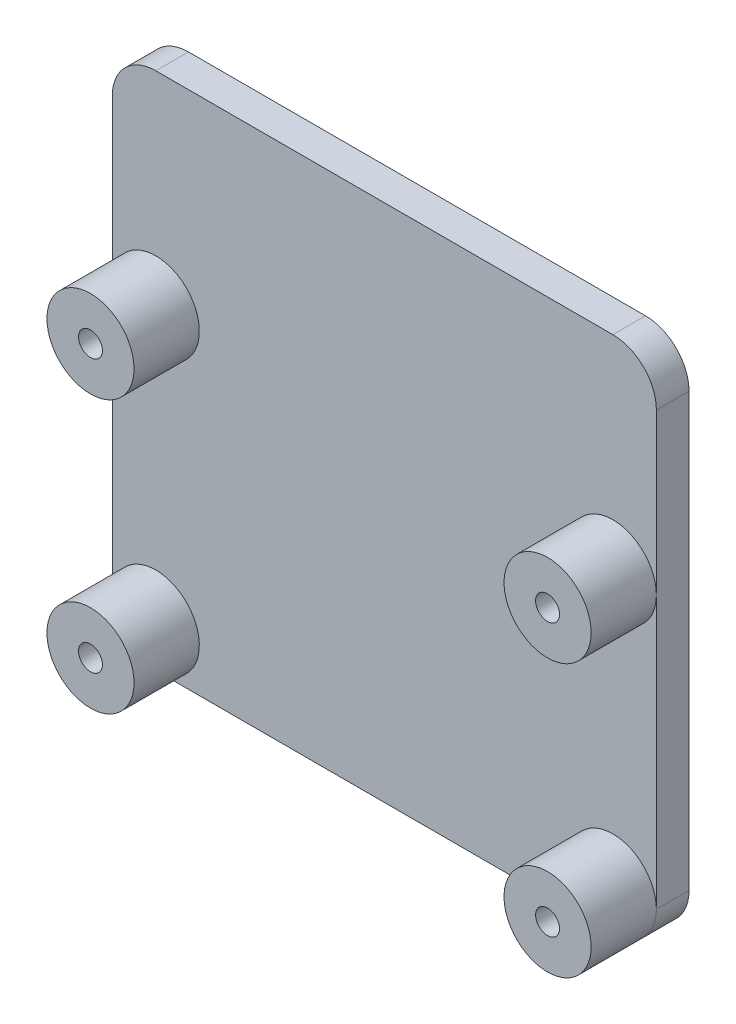
ISO-10303-21;
HEADER;
FILE_DESCRIPTION(('STEP AP214'),'2;1');
FILE_NAME('part.step','',(''),(''),'','','');
FILE_SCHEMA(('AUTOMOTIVE_DESIGN { 1 0 10303 214 1 1 1 1 }'));
ENDSEC;
DATA;
#1=APPLICATION_CONTEXT('core data for automotive mechanical design processes');
#2=APPLICATION_PROTOCOL_DEFINITION('international standard','automotive_design',2000,#1);
#3=PRODUCT_CONTEXT('',#1,'mechanical');
#4=PRODUCT('Part','Part','',(#3));
#5=PRODUCT_RELATED_PRODUCT_CATEGORY('part','',(#4));
#6=PRODUCT_DEFINITION_FORMATION('','',#4);
#7=PRODUCT_DEFINITION_CONTEXT('part definition',#1,'design');
#8=PRODUCT_DEFINITION('design','',#6,#7);
#9=PRODUCT_DEFINITION_SHAPE('','',#8);
#10=(LENGTH_UNIT() NAMED_UNIT(*) SI_UNIT(.MILLI.,.METRE.));
#11=(NAMED_UNIT(*) PLANE_ANGLE_UNIT() SI_UNIT($,.RADIAN.));
#12=(NAMED_UNIT(*) SI_UNIT($,.STERADIAN.) SOLID_ANGLE_UNIT());
#13=UNCERTAINTY_MEASURE_WITH_UNIT(LENGTH_MEASURE(1.E-05),#10,'distance_accuracy_value','');
#14=(GEOMETRIC_REPRESENTATION_CONTEXT(3) GLOBAL_UNCERTAINTY_ASSIGNED_CONTEXT((#13)) GLOBAL_UNIT_ASSIGNED_CONTEXT((#10,
#11,#12)) REPRESENTATION_CONTEXT('',''));
#15=CARTESIAN_POINT('',(0.,0.,0.));
#16=DIRECTION('',(0.,0.,1.));
#17=DIRECTION('',(1.,0.,0.));
#18=AXIS2_PLACEMENT_3D('',#15,#16,#17);
#19=CARTESIAN_POINT('',(-7.28237405594401,-77.1896894364136,1.5));
#20=DIRECTION('',(0.,1.,0.));
#21=DIRECTION('',(0.,0.,1.));
#22=AXIS2_PLACEMENT_3D('',#19,#20,#21);
#23=PLANE('',#22);
#24=DIRECTION('',(1.,0.,0.));
#25=VECTOR('',#24,1.);
#26=CARTESIAN_POINT('',(-7.28237405594401,-77.1896894364136,0.));
#27=LINE('',#26,#25);
#28=CARTESIAN_POINT('',(-5.28237405594401,-77.1896894364136,0.));
#29=VERTEX_POINT('',#28);
#30=CARTESIAN_POINT('',(15.717625944056,-77.1896894364136,0.));
#31=VERTEX_POINT('',#30);
#32=EDGE_CURVE('E163',#29,#31,#27,.T.);
#33=ORIENTED_EDGE('',*,*,#32,.T.);
#34=DIRECTION('',(0.,0.,-1.));
#35=VECTOR('',#34,1.);
#36=CARTESIAN_POINT('',(15.717625944056,-77.1896894364136,1.5));
#37=LINE('',#36,#35);
#38=CARTESIAN_POINT('',(15.717625944056,-77.1896894364136,1.5));
#39=VERTEX_POINT('',#38);
#40=EDGE_CURVE('E202',#31,#39,#37,.F.);
#41=ORIENTED_EDGE('',*,*,#40,.T.);
#42=DIRECTION('',(1.,0.,0.));
#43=VECTOR('',#42,1.);
#44=CARTESIAN_POINT('',(-7.28237405594401,-77.1896894364136,1.5));
#45=LINE('',#44,#43);
#46=CARTESIAN_POINT('',(-5.282374055944,-77.1896894364136,1.5));
#47=VERTEX_POINT('',#46);
#48=EDGE_CURVE('E166',#47,#39,#45,.T.);
#49=ORIENTED_EDGE('',*,*,#48,.F.);
#50=DIRECTION('',(0.,0.,-1.));
#51=VECTOR('',#50,1.);
#52=CARTESIAN_POINT('',(-5.282374055944,-77.1896894364136,1.5));
#53=LINE('',#52,#51);
#54=EDGE_CURVE('E139',#47,#29,#53,.T.);
#55=ORIENTED_EDGE('',*,*,#54,.T.);
#56=EDGE_LOOP('',(#33,#41,#49,#55));
#57=FACE_BOUND('',#56,.T.);
#58=ADVANCED_FACE('F36',(#57),#23,.F.);
#59=CARTESIAN_POINT('',(17.717625944056,-77.1896894364136,1.5));
#60=DIRECTION('',(-1.,0.,0.));
#61=DIRECTION('',(0.,-1.,0.));
#62=AXIS2_PLACEMENT_3D('',#59,#60,#61);
#63=PLANE('',#62);
#64=DIRECTION('',(0.,1.,0.));
#65=VECTOR('',#64,1.);
#66=CARTESIAN_POINT('',(17.717625944056,-77.1896894364136,0.));
#67=LINE('',#66,#65);
#68=CARTESIAN_POINT('',(17.717625944056,-75.1896894364136,0.));
#69=VERTEX_POINT('',#68);
#70=CARTESIAN_POINT('',(17.717625944056,-55.3276894364136,0.));
#71=VERTEX_POINT('',#70);
#72=EDGE_CURVE('E174',#69,#71,#67,.T.);
#73=ORIENTED_EDGE('',*,*,#72,.T.);
#74=DIRECTION('',(0.,0.,-1.));
#75=VECTOR('',#74,1.);
#76=CARTESIAN_POINT('',(17.717625944056,-55.3276894364136,1.5));
#77=LINE('',#76,#75);
#78=CARTESIAN_POINT('',(17.717625944056,-55.3276894364136,1.5));
#79=VERTEX_POINT('',#78);
#80=EDGE_CURVE('E59',#71,#79,#77,.F.);
#81=ORIENTED_EDGE('',*,*,#80,.T.);
#82=DIRECTION('',(0.,1.,0.));
#83=VECTOR('',#82,1.);
#84=CARTESIAN_POINT('',(17.717625944056,-77.1896894364136,1.5));
#85=LINE('',#84,#83);
#86=CARTESIAN_POINT('',(17.717625944056,-62.6896894364136,1.5));
#87=VERTEX_POINT('',#86);
#88=EDGE_CURVE('E168',#87,#79,#85,.T.);
#89=ORIENTED_EDGE('',*,*,#88,.F.);
#90=CARTESIAN_POINT('',(17.717625944056,-75.1896894364136,1.5));
#91=VERTEX_POINT('',#90);
#92=EDGE_CURVE('E169',#91,#87,#85,.T.);
#93=ORIENTED_EDGE('',*,*,#92,.F.);
#94=DIRECTION('',(0.,0.,-1.));
#95=VECTOR('',#94,1.);
#96=CARTESIAN_POINT('',(17.717625944056,-75.1896894364136,1.5));
#97=LINE('',#96,#95);
#98=EDGE_CURVE('E194',#91,#69,#97,.T.);
#99=ORIENTED_EDGE('',*,*,#98,.T.);
#100=EDGE_LOOP('',(#73,#81,#89,#93,#99));
#101=FACE_BOUND('',#100,.T.);
#102=ADVANCED_FACE('F219',(#101),#63,.F.);
#103=CARTESIAN_POINT('',(17.717625944056,-53.3276894364136,1.5));
#104=DIRECTION('',(0.,-1.,0.));
#105=DIRECTION('',(1.,0.,0.));
#106=AXIS2_PLACEMENT_3D('',#103,#104,#105);
#107=PLANE('',#106);
#108=DIRECTION('',(-1.,0.,0.));
#109=VECTOR('',#108,1.);
#110=CARTESIAN_POINT('',(17.717625944056,-53.3276894364136,1.5));
#111=LINE('',#110,#109);
#112=CARTESIAN_POINT('',(15.717625944056,-53.3276894364136,1.5));
#113=VERTEX_POINT('',#112);
#114=CARTESIAN_POINT('',(-5.282374055944,-53.3276894364136,1.5));
#115=VERTEX_POINT('',#114);
#116=EDGE_CURVE('E134',#113,#115,#111,.T.);
#117=ORIENTED_EDGE('',*,*,#116,.F.);
#118=DIRECTION('',(0.,0.,-1.));
#119=VECTOR('',#118,1.);
#120=CARTESIAN_POINT('',(15.717625944056,-53.3276894364136,1.5));
#121=LINE('',#120,#119);
#122=CARTESIAN_POINT('',(15.717625944056,-53.3276894364136,0.));
#123=VERTEX_POINT('',#122);
#124=EDGE_CURVE('E183',#113,#123,#121,.T.);
#125=ORIENTED_EDGE('',*,*,#124,.T.);
#126=DIRECTION('',(-1.,0.,0.));
#127=VECTOR('',#126,1.);
#128=CARTESIAN_POINT('',(17.717625944056,-53.3276894364136,0.));
#129=LINE('',#128,#127);
#130=CARTESIAN_POINT('',(-5.282374055944,-53.3276894364136,0.));
#131=VERTEX_POINT('',#130);
#132=EDGE_CURVE('E176',#123,#131,#129,.T.);
#133=ORIENTED_EDGE('',*,*,#132,.T.);
#134=DIRECTION('',(0.,0.,-1.));
#135=VECTOR('',#134,1.);
#136=CARTESIAN_POINT('',(-5.282374055944,-53.3276894364136,1.5));
#137=LINE('',#136,#135);
#138=EDGE_CURVE('E126',#131,#115,#137,.F.);
#139=ORIENTED_EDGE('',*,*,#138,.T.);
#140=EDGE_LOOP('',(#117,#125,#133,#139));
#141=FACE_BOUND('',#140,.T.);
#142=ADVANCED_FACE('F226',(#141),#107,.F.);
#143=CARTESIAN_POINT('',(-7.282374055944,-53.3276894364136,1.5));
#144=DIRECTION('',(1.,0.,0.));
#145=DIRECTION('',(0.,1.,0.));
#146=AXIS2_PLACEMENT_3D('',#143,#144,#145);
#147=PLANE('',#146);
#148=DIRECTION('',(0.,-1.,0.));
#149=VECTOR('',#148,1.);
#150=CARTESIAN_POINT('',(-7.282374055944,-53.3276894364136,0.));
#151=LINE('',#150,#149);
#152=CARTESIAN_POINT('',(-7.282374055944,-55.3276894364136,0.));
#153=VERTEX_POINT('',#152);
#154=CARTESIAN_POINT('',(-7.282374055944,-75.1896894364136,0.));
#155=VERTEX_POINT('',#154);
#156=EDGE_CURVE('E116',#153,#155,#151,.T.);
#157=ORIENTED_EDGE('',*,*,#156,.T.);
#158=DIRECTION('',(0.,0.,-1.));
#159=VECTOR('',#158,1.);
#160=CARTESIAN_POINT('',(-7.282374055944,-75.1896894364136,1.5));
#161=LINE('',#160,#159);
#162=CARTESIAN_POINT('',(-7.28237405594401,-75.1896894364136,1.5));
#163=VERTEX_POINT('',#162);
#164=EDGE_CURVE('E11',#155,#163,#161,.F.);
#165=ORIENTED_EDGE('',*,*,#164,.T.);
#166=DIRECTION('',(0.,-1.,0.));
#167=VECTOR('',#166,1.);
#168=CARTESIAN_POINT('',(-7.282374055944,-53.3276894364136,1.5));
#169=LINE('',#168,#167);
#170=CARTESIAN_POINT('',(-7.282374055944,-62.6896894364136,1.5));
#171=VERTEX_POINT('',#170);
#172=EDGE_CURVE('E113',#171,#163,#169,.T.);
#173=ORIENTED_EDGE('',*,*,#172,.F.);
#174=CARTESIAN_POINT('',(-7.282374055944,-55.3276894364136,1.5));
#175=VERTEX_POINT('',#174);
#176=EDGE_CURVE('E133',#175,#171,#169,.T.);
#177=ORIENTED_EDGE('',*,*,#176,.F.);
#178=DIRECTION('',(0.,0.,-1.));
#179=VECTOR('',#178,1.);
#180=CARTESIAN_POINT('',(-7.282374055944,-55.3276894364136,1.5));
#181=LINE('',#180,#179);
#182=EDGE_CURVE('E44',#175,#153,#181,.T.);
#183=ORIENTED_EDGE('',*,*,#182,.T.);
#184=EDGE_LOOP('',(#157,#165,#173,#177,#183));
#185=FACE_BOUND('',#184,.T.);
#186=ADVANCED_FACE('F111',(#185),#147,.F.);
#187=CARTESIAN_POINT('',(0.,0.,1.5));
#188=DIRECTION('',(0.,0.,1.));
#189=DIRECTION('',(1.,0.,0.));
#190=AXIS2_PLACEMENT_3D('',#187,#188,#189);
#191=PLANE('',#190);
#192=ORIENTED_EDGE('',*,*,#88,.T.);
#193=CARTESIAN_POINT('',(15.717625944056,-55.3276894364136,1.5));
#194=DIRECTION('',(0.,0.,1.));
#195=DIRECTION('',(1.,0.,0.));
#196=AXIS2_PLACEMENT_3D('',#193,#194,#195);
#197=CIRCLE('',#196,2.);
#198=EDGE_CURVE('E199',#79,#113,#197,.T.);
#199=ORIENTED_EDGE('',*,*,#198,.T.);
#200=ORIENTED_EDGE('',*,*,#116,.T.);
#201=CARTESIAN_POINT('',(-5.282374055944,-55.3276894364136,1.5));
#202=DIRECTION('',(0.,0.,1.));
#203=DIRECTION('',(1.,0.,0.));
#204=AXIS2_PLACEMENT_3D('',#201,#202,#203);
#205=CIRCLE('',#204,2.);
#206=EDGE_CURVE('E51',#115,#175,#205,.T.);
#207=ORIENTED_EDGE('',*,*,#206,.T.);
#208=ORIENTED_EDGE('',*,*,#176,.T.);
#209=CARTESIAN_POINT('',(-5.28237405594401,-62.6896894364136,1.5));
#210=DIRECTION('',(0.,0.,1.));
#211=DIRECTION('',(1.,0.,0.));
#212=AXIS2_PLACEMENT_3D('',#209,#210,#211);
#213=CIRCLE('',#212,2.);
#214=EDGE_CURVE('E132',#171,#171,#213,.T.);
#215=ORIENTED_EDGE('',*,*,#214,.F.);
#216=ORIENTED_EDGE('',*,*,#172,.T.);
#217=CARTESIAN_POINT('',(-5.282374055944,-75.1896894364136,1.5));
#218=DIRECTION('',(0.,0.,1.));
#219=DIRECTION('',(1.,0.,0.));
#220=AXIS2_PLACEMENT_3D('',#217,#218,#219);
#221=CIRCLE('',#220,2.);
#222=EDGE_CURVE('E121',#163,#47,#221,.F.);
#223=ORIENTED_EDGE('',*,*,#222,.T.);
#224=ORIENTED_EDGE('',*,*,#48,.T.);
#225=CARTESIAN_POINT('',(15.717625944056,-75.1896894364136,1.5));
#226=DIRECTION('',(0.,0.,1.));
#227=DIRECTION('',(1.,0.,0.));
#228=AXIS2_PLACEMENT_3D('',#225,#226,#227);
#229=CIRCLE('',#228,2.);
#230=EDGE_CURVE('E152',#91,#39,#229,.T.);
#231=ORIENTED_EDGE('',*,*,#230,.F.);
#232=ORIENTED_EDGE('',*,*,#92,.T.);
#233=CARTESIAN_POINT('',(15.717625944056,-62.6896894364136,1.5));
#234=DIRECTION('',(0.,0.,1.));
#235=DIRECTION('',(1.,0.,0.));
#236=AXIS2_PLACEMENT_3D('',#233,#234,#235);
#237=CIRCLE('',#236,2.00000000000001);
#238=EDGE_CURVE('E157',#87,#87,#237,.T.);
#239=ORIENTED_EDGE('',*,*,#238,.F.);
#240=EDGE_LOOP('',(#192,#199,#200,#207,#208,#215,#216,#223,#224,#231,#232,#239));
#241=FACE_BOUND('',#240,.T.);
#242=ADVANCED_FACE('F130',(#241),#191,.T.);
#243=CARTESIAN_POINT('',(0.,0.,0.));
#244=DIRECTION('',(0.,0.,1.));
#245=DIRECTION('',(1.,0.,0.));
#246=AXIS2_PLACEMENT_3D('',#243,#244,#245);
#247=PLANE('',#246);
#248=CARTESIAN_POINT('',(-5.282374055944,-75.1896894364136,0.));
#249=DIRECTION('',(0.,0.,1.));
#250=DIRECTION('',(1.,0.,0.));
#251=AXIS2_PLACEMENT_3D('',#248,#249,#250);
#252=CIRCLE('',#251,0.549999999999995);
#253=CARTESIAN_POINT('',(-4.73237405594401,-75.1896894364136,0.));
#254=VERTEX_POINT('',#253);
#255=EDGE_CURVE('E386',#254,#254,#252,.F.);
#256=ORIENTED_EDGE('',*,*,#255,.F.);
#257=EDGE_LOOP('',(#256));
#258=FACE_BOUND('',#257,.T.);
#259=CARTESIAN_POINT('',(15.717625944056,-75.1896894364136,0.));
#260=DIRECTION('',(0.,0.,1.));
#261=DIRECTION('',(1.,0.,0.));
#262=AXIS2_PLACEMENT_3D('',#259,#260,#261);
#263=CIRCLE('',#262,0.549999999999998);
#264=CARTESIAN_POINT('',(16.267625944056,-75.1896894364136,0.));
#265=VERTEX_POINT('',#264);
#266=EDGE_CURVE('E378',#265,#265,#263,.F.);
#267=ORIENTED_EDGE('',*,*,#266,.F.);
#268=EDGE_LOOP('',(#267));
#269=FACE_BOUND('',#268,.T.);
#270=CARTESIAN_POINT('',(15.717625944056,-62.6896894364136,0.));
#271=DIRECTION('',(0.,0.,1.));
#272=DIRECTION('',(1.,0.,0.));
#273=AXIS2_PLACEMENT_3D('',#270,#271,#272);
#274=CIRCLE('',#273,0.550000000000001);
#275=CARTESIAN_POINT('',(16.267625944056,-62.6896894364136,0.));
#276=VERTEX_POINT('',#275);
#277=EDGE_CURVE('E374',#276,#276,#274,.F.);
#278=ORIENTED_EDGE('',*,*,#277,.F.);
#279=EDGE_LOOP('',(#278));
#280=FACE_BOUND('',#279,.T.);
#281=CARTESIAN_POINT('',(-5.28237405594401,-62.6896894364136,0.));
#282=DIRECTION('',(0.,0.,1.));
#283=DIRECTION('',(1.,0.,0.));
#284=AXIS2_PLACEMENT_3D('',#281,#282,#283);
#285=CIRCLE('',#284,0.550000000000001);
#286=CARTESIAN_POINT('',(-4.73237405594401,-62.6896894364136,0.));
#287=VERTEX_POINT('',#286);
#288=EDGE_CURVE('E141',#287,#287,#285,.F.);
#289=ORIENTED_EDGE('',*,*,#288,.F.);
#290=EDGE_LOOP('',(#289));
#291=FACE_BOUND('',#290,.T.);
#292=ORIENTED_EDGE('',*,*,#132,.F.);
#293=CARTESIAN_POINT('',(15.717625944056,-55.3276894364136,0.));
#294=DIRECTION('',(0.,0.,1.));
#295=DIRECTION('',(1.,0.,0.));
#296=AXIS2_PLACEMENT_3D('',#293,#294,#295);
#297=CIRCLE('',#296,2.);
#298=EDGE_CURVE('E192',#123,#71,#297,.F.);
#299=ORIENTED_EDGE('',*,*,#298,.T.);
#300=ORIENTED_EDGE('',*,*,#72,.F.);
#301=CARTESIAN_POINT('',(15.717625944056,-75.1896894364136,0.));
#302=DIRECTION('',(0.,0.,1.));
#303=DIRECTION('',(1.,0.,0.));
#304=AXIS2_PLACEMENT_3D('',#301,#302,#303);
#305=CIRCLE('',#304,2.);
#306=EDGE_CURVE('E190',#69,#31,#305,.F.);
#307=ORIENTED_EDGE('',*,*,#306,.T.);
#308=ORIENTED_EDGE('',*,*,#32,.F.);
#309=CARTESIAN_POINT('',(-5.282374055944,-75.1896894364136,0.));
#310=DIRECTION('',(0.,0.,1.));
#311=DIRECTION('',(1.,0.,0.));
#312=AXIS2_PLACEMENT_3D('',#309,#310,#311);
#313=CIRCLE('',#312,2.);
#314=EDGE_CURVE('E188',#29,#155,#313,.F.);
#315=ORIENTED_EDGE('',*,*,#314,.T.);
#316=ORIENTED_EDGE('',*,*,#156,.F.);
#317=CARTESIAN_POINT('',(-5.282374055944,-55.3276894364136,0.));
#318=DIRECTION('',(0.,0.,1.));
#319=DIRECTION('',(1.,0.,0.));
#320=AXIS2_PLACEMENT_3D('',#317,#318,#319);
#321=CIRCLE('',#320,2.);
#322=EDGE_CURVE('E186',#153,#131,#321,.F.);
#323=ORIENTED_EDGE('',*,*,#322,.T.);
#324=EDGE_LOOP('',(#292,#299,#300,#307,#308,#315,#316,#323));
#325=FACE_BOUND('',#324,.T.);
#326=ADVANCED_FACE('F207',(#258,#269,#280,#291,#325),#247,.F.);
#327=CARTESIAN_POINT('',(15.717625944056,-62.6896894364136,4.5));
#328=DIRECTION('',(0.,0.,-1.));
#329=DIRECTION('',(-1.,0.,0.));
#330=AXIS2_PLACEMENT_3D('',#327,#328,#329);
#331=CYLINDRICAL_SURFACE('',#330,2.00000000000001);
#332=CARTESIAN_POINT('',(15.717625944056,-62.6896894364136,4.5));
#333=DIRECTION('',(0.,0.,1.));
#334=DIRECTION('',(1.,0.,0.));
#335=AXIS2_PLACEMENT_3D('',#332,#333,#334);
#336=CIRCLE('',#335,2.00000000000001);
#337=CARTESIAN_POINT('',(17.717625944056,-62.6896894364136,4.5));
#338=VERTEX_POINT('',#337);
#339=EDGE_CURVE('E160',#338,#338,#336,.T.);
#340=ORIENTED_EDGE('',*,*,#339,.F.);
#341=EDGE_LOOP('',(#340));
#342=FACE_BOUND('',#341,.T.);
#343=ORIENTED_EDGE('',*,*,#238,.T.);
#344=EDGE_LOOP('',(#343));
#345=FACE_BOUND('',#344,.T.);
#346=ADVANCED_FACE('F271',(#342,#345),#331,.T.);
#347=CARTESIAN_POINT('',(0.,0.,4.5));
#348=DIRECTION('',(0.,0.,1.));
#349=DIRECTION('',(1.,0.,0.));
#350=AXIS2_PLACEMENT_3D('',#347,#348,#349);
#351=PLANE('',#350);
#352=CARTESIAN_POINT('',(15.717625944056,-62.6896894364136,4.5));
#353=DIRECTION('',(0.,0.,1.));
#354=DIRECTION('',(1.,0.,0.));
#355=AXIS2_PLACEMENT_3D('',#352,#353,#354);
#356=CIRCLE('',#355,0.550000000000001);
#357=CARTESIAN_POINT('',(16.267625944056,-62.6896894364136,4.5));
#358=VERTEX_POINT('',#357);
#359=EDGE_CURVE('E377',#358,#358,#356,.T.);
#360=ORIENTED_EDGE('',*,*,#359,.F.);
#361=EDGE_LOOP('',(#360));
#362=FACE_BOUND('',#361,.T.);
#363=ORIENTED_EDGE('',*,*,#339,.T.);
#364=EDGE_LOOP('',(#363));
#365=FACE_BOUND('',#364,.T.);
#366=ADVANCED_FACE('F279',(#362,#365),#351,.T.);
#367=CARTESIAN_POINT('',(15.717625944056,-75.1896894364136,4.5));
#368=DIRECTION('',(0.,0.,-1.));
#369=DIRECTION('',(-1.,0.,0.));
#370=AXIS2_PLACEMENT_3D('',#367,#368,#369);
#371=CYLINDRICAL_SURFACE('',#370,2.);
#372=CARTESIAN_POINT('',(15.717625944056,-75.1896894364136,4.5));
#373=DIRECTION('',(0.,0.,1.));
#374=DIRECTION('',(1.,0.,0.));
#375=AXIS2_PLACEMENT_3D('',#372,#373,#374);
#376=CIRCLE('',#375,2.);
#377=CARTESIAN_POINT('',(17.717625944056,-75.1896894364136,4.5));
#378=VERTEX_POINT('',#377);
#379=EDGE_CURVE('E154',#378,#378,#376,.T.);
#380=ORIENTED_EDGE('',*,*,#379,.F.);
#381=EDGE_LOOP('',(#380));
#382=FACE_BOUND('',#381,.T.);
#383=ORIENTED_EDGE('',*,*,#230,.T.);
#384=CARTESIAN_POINT('',(15.717625944056,-75.1896894364136,1.5));
#385=DIRECTION('',(0.,0.,1.));
#386=DIRECTION('',(1.,0.,0.));
#387=AXIS2_PLACEMENT_3D('',#384,#385,#386);
#388=CIRCLE('',#387,2.);
#389=EDGE_CURVE('E127',#91,#39,#388,.F.);
#390=ORIENTED_EDGE('',*,*,#389,.F.);
#391=EDGE_LOOP('',(#383,#390));
#392=FACE_BOUND('',#391,.T.);
#393=ADVANCED_FACE('F214',(#382,#392),#371,.T.);
#394=CARTESIAN_POINT('',(0.,0.,4.5));
#395=DIRECTION('',(0.,0.,1.));
#396=DIRECTION('',(1.,0.,0.));
#397=AXIS2_PLACEMENT_3D('',#394,#395,#396);
#398=PLANE('',#397);
#399=CARTESIAN_POINT('',(15.717625944056,-75.1896894364136,4.5));
#400=DIRECTION('',(0.,0.,1.));
#401=DIRECTION('',(1.,0.,0.));
#402=AXIS2_PLACEMENT_3D('',#399,#400,#401);
#403=CIRCLE('',#402,0.549999999999998);
#404=CARTESIAN_POINT('',(16.267625944056,-75.1896894364136,4.5));
#405=VERTEX_POINT('',#404);
#406=EDGE_CURVE('E382',#405,#405,#403,.T.);
#407=ORIENTED_EDGE('',*,*,#406,.F.);
#408=EDGE_LOOP('',(#407));
#409=FACE_BOUND('',#408,.T.);
#410=ORIENTED_EDGE('',*,*,#379,.T.);
#411=EDGE_LOOP('',(#410));
#412=FACE_BOUND('',#411,.T.);
#413=ADVANCED_FACE('F295',(#409,#412),#398,.T.);
#414=CARTESIAN_POINT('',(-5.28237405594401,-62.6896894364136,4.5));
#415=DIRECTION('',(0.,0.,-1.));
#416=DIRECTION('',(-1.,0.,0.));
#417=AXIS2_PLACEMENT_3D('',#414,#415,#416);
#418=CYLINDRICAL_SURFACE('',#417,2.);
#419=CARTESIAN_POINT('',(-5.28237405594401,-62.6896894364136,4.5));
#420=DIRECTION('',(0.,0.,1.));
#421=DIRECTION('',(1.,0.,0.));
#422=AXIS2_PLACEMENT_3D('',#419,#420,#421);
#423=CIRCLE('',#422,2.);
#424=CARTESIAN_POINT('',(-3.28237405594401,-62.6896894364136,4.5));
#425=VERTEX_POINT('',#424);
#426=EDGE_CURVE('E149',#425,#425,#423,.T.);
#427=ORIENTED_EDGE('',*,*,#426,.F.);
#428=EDGE_LOOP('',(#427));
#429=FACE_BOUND('',#428,.T.);
#430=ORIENTED_EDGE('',*,*,#214,.T.);
#431=EDGE_LOOP('',(#430));
#432=FACE_BOUND('',#431,.T.);
#433=ADVANCED_FACE('F304',(#429,#432),#418,.T.);
#434=CARTESIAN_POINT('',(0.,0.,4.5));
#435=DIRECTION('',(0.,0.,1.));
#436=DIRECTION('',(1.,0.,0.));
#437=AXIS2_PLACEMENT_3D('',#434,#435,#436);
#438=PLANE('',#437);
#439=CARTESIAN_POINT('',(-5.28237405594401,-62.6896894364136,4.5));
#440=DIRECTION('',(0.,0.,1.));
#441=DIRECTION('',(1.,0.,0.));
#442=AXIS2_PLACEMENT_3D('',#439,#440,#441);
#443=CIRCLE('',#442,0.550000000000001);
#444=CARTESIAN_POINT('',(-4.73237405594401,-62.6896894364136,4.5));
#445=VERTEX_POINT('',#444);
#446=EDGE_CURVE('E146',#445,#445,#443,.T.);
#447=ORIENTED_EDGE('',*,*,#446,.F.);
#448=EDGE_LOOP('',(#447));
#449=FACE_BOUND('',#448,.T.);
#450=ORIENTED_EDGE('',*,*,#426,.T.);
#451=EDGE_LOOP('',(#450));
#452=FACE_BOUND('',#451,.T.);
#453=ADVANCED_FACE('F312',(#449,#452),#438,.T.);
#454=CARTESIAN_POINT('',(-5.282374055944,-75.1896894364136,4.5));
#455=DIRECTION('',(0.,0.,-1.));
#456=DIRECTION('',(-1.,0.,0.));
#457=AXIS2_PLACEMENT_3D('',#454,#455,#456);
#458=CYLINDRICAL_SURFACE('',#457,2.);
#459=CARTESIAN_POINT('',(-5.282374055944,-75.1896894364136,4.5));
#460=DIRECTION('',(0.,0.,1.));
#461=DIRECTION('',(1.,0.,0.));
#462=AXIS2_PLACEMENT_3D('',#459,#460,#461);
#463=CIRCLE('',#462,2.);
#464=CARTESIAN_POINT('',(-3.282374055944,-75.1896894364136,4.5));
#465=VERTEX_POINT('',#464);
#466=EDGE_CURVE('E140',#465,#465,#463,.T.);
#467=ORIENTED_EDGE('',*,*,#466,.F.);
#468=EDGE_LOOP('',(#467));
#469=FACE_BOUND('',#468,.T.);
#470=CARTESIAN_POINT('',(-5.282374055944,-75.1896894364136,1.5));
#471=DIRECTION('',(0.,0.,1.));
#472=DIRECTION('',(1.,0.,0.));
#473=AXIS2_PLACEMENT_3D('',#470,#471,#472);
#474=CIRCLE('',#473,2.);
#475=EDGE_CURVE('E123',#163,#47,#474,.T.);
#476=ORIENTED_EDGE('',*,*,#475,.T.);
#477=ORIENTED_EDGE('',*,*,#222,.F.);
#478=EDGE_LOOP('',(#476,#477));
#479=FACE_BOUND('',#478,.T.);
#480=ADVANCED_FACE('F122',(#469,#479),#458,.T.);
#481=CARTESIAN_POINT('',(0.,0.,4.5));
#482=DIRECTION('',(0.,0.,1.));
#483=DIRECTION('',(1.,0.,0.));
#484=AXIS2_PLACEMENT_3D('',#481,#482,#483);
#485=PLANE('',#484);
#486=CARTESIAN_POINT('',(-5.282374055944,-75.1896894364136,4.5));
#487=DIRECTION('',(0.,0.,1.));
#488=DIRECTION('',(1.,0.,0.));
#489=AXIS2_PLACEMENT_3D('',#486,#487,#488);
#490=CIRCLE('',#489,0.549999999999995);
#491=CARTESIAN_POINT('',(-4.73237405594401,-75.1896894364136,4.5));
#492=VERTEX_POINT('',#491);
#493=EDGE_CURVE('E388',#492,#492,#490,.T.);
#494=ORIENTED_EDGE('',*,*,#493,.F.);
#495=EDGE_LOOP('',(#494));
#496=FACE_BOUND('',#495,.T.);
#497=ORIENTED_EDGE('',*,*,#466,.T.);
#498=EDGE_LOOP('',(#497));
#499=FACE_BOUND('',#498,.T.);
#500=ADVANCED_FACE('F328',(#496,#499),#485,.T.);
#501=CARTESIAN_POINT('',(-5.282374055944,-75.1896894364136,-1.55563491861041));
#502=DIRECTION('',(0.,0.,1.));
#503=DIRECTION('',(1.,0.,0.));
#504=AXIS2_PLACEMENT_3D('',#501,#502,#503);
#505=CYLINDRICAL_SURFACE('',#504,0.549999999999995);
#506=ORIENTED_EDGE('',*,*,#255,.T.);
#507=EDGE_LOOP('',(#506));
#508=FACE_BOUND('',#507,.T.);
#509=ORIENTED_EDGE('',*,*,#493,.T.);
#510=EDGE_LOOP('',(#509));
#511=FACE_BOUND('',#510,.T.);
#512=ADVANCED_FACE('F337',(#508,#511),#505,.F.);
#513=CARTESIAN_POINT('',(-5.28237405594401,-62.6896894364136,-1.55563491861041));
#514=DIRECTION('',(0.,0.,1.));
#515=DIRECTION('',(1.,0.,0.));
#516=AXIS2_PLACEMENT_3D('',#513,#514,#515);
#517=CYLINDRICAL_SURFACE('',#516,0.550000000000001);
#518=ORIENTED_EDGE('',*,*,#288,.T.);
#519=EDGE_LOOP('',(#518));
#520=FACE_BOUND('',#519,.T.);
#521=ORIENTED_EDGE('',*,*,#446,.T.);
#522=EDGE_LOOP('',(#521));
#523=FACE_BOUND('',#522,.T.);
#524=ADVANCED_FACE('F345',(#520,#523),#517,.F.);
#525=CARTESIAN_POINT('',(15.717625944056,-75.1896894364136,-1.55563491861041));
#526=DIRECTION('',(0.,0.,1.));
#527=DIRECTION('',(1.,0.,0.));
#528=AXIS2_PLACEMENT_3D('',#525,#526,#527);
#529=CYLINDRICAL_SURFACE('',#528,0.549999999999998);
#530=ORIENTED_EDGE('',*,*,#266,.T.);
#531=EDGE_LOOP('',(#530));
#532=FACE_BOUND('',#531,.T.);
#533=ORIENTED_EDGE('',*,*,#406,.T.);
#534=EDGE_LOOP('',(#533));
#535=FACE_BOUND('',#534,.T.);
#536=ADVANCED_FACE('F353',(#532,#535),#529,.F.);
#537=CARTESIAN_POINT('',(15.717625944056,-62.6896894364136,-1.55563491861041));
#538=DIRECTION('',(0.,0.,1.));
#539=DIRECTION('',(1.,0.,0.));
#540=AXIS2_PLACEMENT_3D('',#537,#538,#539);
#541=CYLINDRICAL_SURFACE('',#540,0.550000000000001);
#542=ORIENTED_EDGE('',*,*,#277,.T.);
#543=EDGE_LOOP('',(#542));
#544=FACE_BOUND('',#543,.T.);
#545=ORIENTED_EDGE('',*,*,#359,.T.);
#546=EDGE_LOOP('',(#545));
#547=FACE_BOUND('',#546,.T.);
#548=ADVANCED_FACE('F242',(#544,#547),#541,.F.);
#549=CARTESIAN_POINT('',(15.717625944056,-55.3276894364136,1.5));
#550=DIRECTION('',(0.,0.,-1.));
#551=DIRECTION('',(-1.,0.,0.));
#552=AXIS2_PLACEMENT_3D('',#549,#550,#551);
#553=CYLINDRICAL_SURFACE('',#552,2.);
#554=ORIENTED_EDGE('',*,*,#198,.F.);
#555=ORIENTED_EDGE('',*,*,#80,.F.);
#556=ORIENTED_EDGE('',*,*,#298,.F.);
#557=ORIENTED_EDGE('',*,*,#124,.F.);
#558=EDGE_LOOP('',(#554,#555,#556,#557));
#559=FACE_BOUND('',#558,.T.);
#560=ADVANCED_FACE('F223',(#559),#553,.T.);
#561=CARTESIAN_POINT('',(15.717625944056,-75.1896894364136,1.5));
#562=DIRECTION('',(0.,0.,-1.));
#563=DIRECTION('',(-1.,0.,0.));
#564=AXIS2_PLACEMENT_3D('',#561,#562,#563);
#565=CYLINDRICAL_SURFACE('',#564,2.);
#566=ORIENTED_EDGE('',*,*,#389,.T.);
#567=ORIENTED_EDGE('',*,*,#40,.F.);
#568=ORIENTED_EDGE('',*,*,#306,.F.);
#569=ORIENTED_EDGE('',*,*,#98,.F.);
#570=EDGE_LOOP('',(#566,#567,#568,#569));
#571=FACE_BOUND('',#570,.T.);
#572=ADVANCED_FACE('F217',(#571),#565,.T.);
#573=CARTESIAN_POINT('',(-5.282374055944,-75.1896894364136,1.5));
#574=DIRECTION('',(0.,0.,-1.));
#575=DIRECTION('',(-1.,0.,0.));
#576=AXIS2_PLACEMENT_3D('',#573,#574,#575);
#577=CYLINDRICAL_SURFACE('',#576,2.);
#578=ORIENTED_EDGE('',*,*,#475,.F.);
#579=ORIENTED_EDGE('',*,*,#164,.F.);
#580=ORIENTED_EDGE('',*,*,#314,.F.);
#581=ORIENTED_EDGE('',*,*,#54,.F.);
#582=EDGE_LOOP('',(#578,#579,#580,#581));
#583=FACE_BOUND('',#582,.T.);
#584=ADVANCED_FACE('F137',(#583),#577,.T.);
#585=CARTESIAN_POINT('',(-5.282374055944,-55.3276894364136,1.5));
#586=DIRECTION('',(0.,0.,-1.));
#587=DIRECTION('',(-1.,0.,0.));
#588=AXIS2_PLACEMENT_3D('',#585,#586,#587);
#589=CYLINDRICAL_SURFACE('',#588,2.);
#590=ORIENTED_EDGE('',*,*,#206,.F.);
#591=ORIENTED_EDGE('',*,*,#138,.F.);
#592=ORIENTED_EDGE('',*,*,#322,.F.);
#593=ORIENTED_EDGE('',*,*,#182,.F.);
#594=EDGE_LOOP('',(#590,#591,#592,#593));
#595=FACE_BOUND('',#594,.T.);
#596=ADVANCED_FACE('F38',(#595),#589,.T.);
#597=CLOSED_SHELL('',(#58,#102,#142,#186,#242,#326,#346,#366,#393,#413,#433,#453,#480,#500,#512,
#524,#536,#548,#560,#572,#584,#596));
#598=MANIFOLD_SOLID_BREP('B2',#597);
#599=ADVANCED_BREP_SHAPE_REPRESENTATION('',(#18,#598),#14);
#600=SHAPE_DEFINITION_REPRESENTATION(#9,#599);
ENDSEC;
END-ISO-10303-21;
